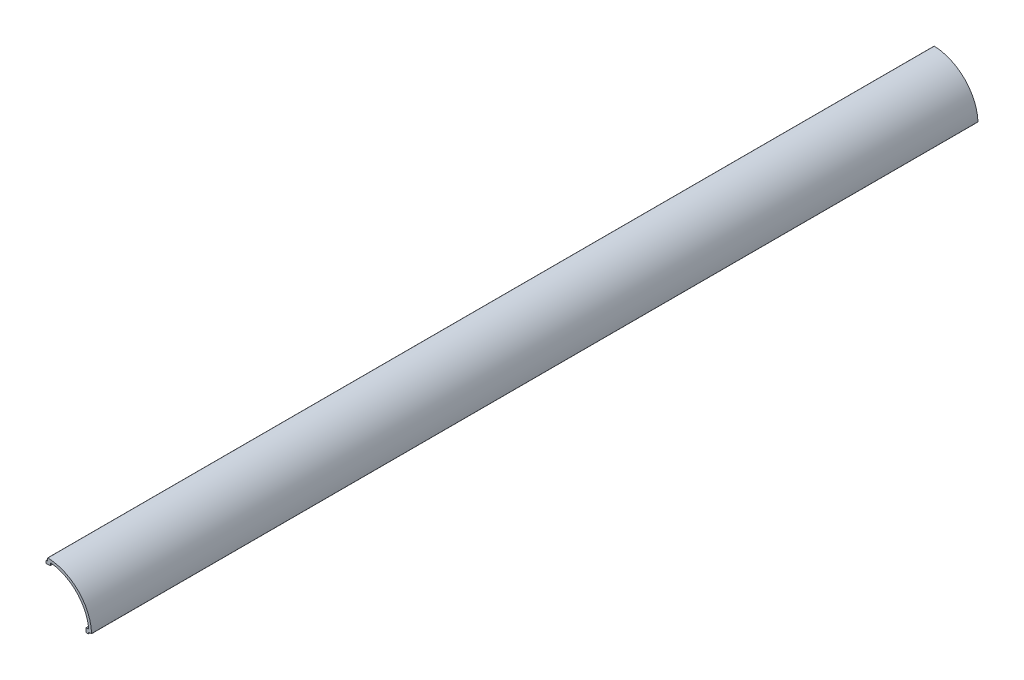
ISO-10303-21;
HEADER;
FILE_DESCRIPTION(('STEP AP214'),'2;1');
FILE_NAME('part.step','',(''),(''),'','','');
FILE_SCHEMA(('AUTOMOTIVE_DESIGN { 1 0 10303 214 1 1 1 1 }'));
ENDSEC;
DATA;
#1=APPLICATION_CONTEXT('core data for automotive mechanical design processes');
#2=APPLICATION_PROTOCOL_DEFINITION('international standard','automotive_design',2000,#1);
#3=PRODUCT_CONTEXT('',#1,'mechanical');
#4=PRODUCT('Part','Part','',(#3));
#5=PRODUCT_RELATED_PRODUCT_CATEGORY('part','',(#4));
#6=PRODUCT_DEFINITION_FORMATION('','',#4);
#7=PRODUCT_DEFINITION_CONTEXT('part definition',#1,'design');
#8=PRODUCT_DEFINITION('design','',#6,#7);
#9=PRODUCT_DEFINITION_SHAPE('','',#8);
#10=(LENGTH_UNIT() NAMED_UNIT(*) SI_UNIT(.MILLI.,.METRE.));
#11=(NAMED_UNIT(*) PLANE_ANGLE_UNIT() SI_UNIT($,.RADIAN.));
#12=(NAMED_UNIT(*) SI_UNIT($,.STERADIAN.) SOLID_ANGLE_UNIT());
#13=UNCERTAINTY_MEASURE_WITH_UNIT(LENGTH_MEASURE(1.E-05),#10,'distance_accuracy_value','');
#14=(GEOMETRIC_REPRESENTATION_CONTEXT(3) GLOBAL_UNCERTAINTY_ASSIGNED_CONTEXT((#13)) GLOBAL_UNIT_ASSIGNED_CONTEXT((#10,
#11,#12)) REPRESENTATION_CONTEXT('',''));
#15=CARTESIAN_POINT('',(0.,0.,0.));
#16=DIRECTION('',(0.,0.,1.));
#17=DIRECTION('',(1.,0.,0.));
#18=AXIS2_PLACEMENT_3D('',#15,#16,#17);
#19=CARTESIAN_POINT('',(13.5166295470958,0.,150.));
#20=DIRECTION('',(1.,0.,0.));
#21=DIRECTION('',(0.,1.,0.));
#22=AXIS2_PLACEMENT_3D('',#19,#20,#21);
#23=PLANE('',#22);
#24=DIRECTION('',(0.,-1.,0.));
#25=VECTOR('',#24,1.);
#26=CARTESIAN_POINT('',(13.5166295470958,0.,150.));
#27=LINE('',#26,#25);
#28=CARTESIAN_POINT('',(13.5166295470958,1.35000000000005,150.));
#29=VERTEX_POINT('',#28);
#30=CARTESIAN_POINT('',(13.5166295470958,0.100000000000053,150.));
#31=VERTEX_POINT('',#30);
#32=EDGE_CURVE('E233',#29,#31,#27,.T.);
#33=ORIENTED_EDGE('',*,*,#32,.F.);
#34=DIRECTION('',(0.,0.,-1.));
#35=VECTOR('',#34,1.);
#36=CARTESIAN_POINT('',(13.5166295470958,1.35000000000005,150.));
#37=LINE('',#36,#35);
#38=CARTESIAN_POINT('',(13.5166295470958,1.35000000000005,-150.));
#39=VERTEX_POINT('',#38);
#40=EDGE_CURVE('E278',#29,#39,#37,.T.);
#41=ORIENTED_EDGE('',*,*,#40,.T.);
#42=DIRECTION('',(0.,-1.,0.));
#43=VECTOR('',#42,1.);
#44=CARTESIAN_POINT('',(13.5166295470958,0.,-150.));
#45=LINE('',#44,#43);
#46=CARTESIAN_POINT('',(13.5166295470958,0.100000000000053,-150.));
#47=VERTEX_POINT('',#46);
#48=EDGE_CURVE('E366',#39,#47,#45,.T.);
#49=ORIENTED_EDGE('',*,*,#48,.T.);
#50=DIRECTION('',(0.,0.,-1.));
#51=VECTOR('',#50,1.);
#52=CARTESIAN_POINT('',(13.5166295470958,0.100000000000053,150.));
#53=LINE('',#52,#51);
#54=EDGE_CURVE('E276',#47,#31,#53,.F.);
#55=ORIENTED_EDGE('',*,*,#54,.T.);
#56=EDGE_LOOP('',(#33,#41,#49,#55));
#57=FACE_BOUND('',#56,.T.);
#58=ADVANCED_FACE('F33',(#57),#23,.F.);
#59=CARTESIAN_POINT('',(14.4166295470958,0.,150.));
#60=DIRECTION('',(0.,-1.,0.));
#61=DIRECTION('',(1.,0.,0.));
#62=AXIS2_PLACEMENT_3D('',#59,#60,#61);
#63=PLANE('',#62);
#64=DIRECTION('',(-1.,0.,0.));
#65=VECTOR('',#64,1.);
#66=CARTESIAN_POINT('',(14.4166295470958,0.,-150.));
#67=LINE('',#66,#65);
#68=CARTESIAN_POINT('',(14.3166295470958,0.,-150.));
#69=VERTEX_POINT('',#68);
#70=CARTESIAN_POINT('',(13.6166295470958,0.,-150.));
#71=VERTEX_POINT('',#70);
#72=EDGE_CURVE('E369',#69,#71,#67,.T.);
#73=ORIENTED_EDGE('',*,*,#72,.F.);
#74=DIRECTION('',(0.,0.,-1.));
#75=VECTOR('',#74,1.);
#76=CARTESIAN_POINT('',(14.3166295470958,0.,150.));
#77=LINE('',#76,#75);
#78=CARTESIAN_POINT('',(14.3166295470958,0.,150.));
#79=VERTEX_POINT('',#78);
#80=EDGE_CURVE('E299',#69,#79,#77,.F.);
#81=ORIENTED_EDGE('',*,*,#80,.T.);
#82=DIRECTION('',(-1.,0.,0.));
#83=VECTOR('',#82,1.);
#84=CARTESIAN_POINT('',(14.4166295470958,0.,150.));
#85=LINE('',#84,#83);
#86=CARTESIAN_POINT('',(13.6166295470958,0.,150.));
#87=VERTEX_POINT('',#86);
#88=EDGE_CURVE('E647',#79,#87,#85,.T.);
#89=ORIENTED_EDGE('',*,*,#88,.T.);
#90=DIRECTION('',(0.,0.,-1.));
#91=VECTOR('',#90,1.);
#92=CARTESIAN_POINT('',(13.6166295470958,0.,-150.));
#93=LINE('',#92,#91);
#94=EDGE_CURVE('E296',#87,#71,#93,.T.);
#95=ORIENTED_EDGE('',*,*,#94,.T.);
#96=EDGE_LOOP('',(#73,#81,#89,#95));
#97=FACE_BOUND('',#96,.T.);
#98=ADVANCED_FACE('F404',(#97),#63,.T.);
#99=CARTESIAN_POINT('',(14.4166295470958,0.,150.));
#100=DIRECTION('',(1.,0.,0.));
#101=DIRECTION('',(0.,1.,0.));
#102=AXIS2_PLACEMENT_3D('',#99,#100,#101);
#103=PLANE('',#102);
#104=DIRECTION('',(0.,-1.,0.));
#105=VECTOR('',#104,1.);
#106=CARTESIAN_POINT('',(14.4166295470958,0.,-150.));
#107=LINE('',#106,#105);
#108=CARTESIAN_POINT('',(14.4166295470958,0.450000000000057,-150.));
#109=VERTEX_POINT('',#108);
#110=CARTESIAN_POINT('',(14.4166295470958,0.100000000000058,-150.));
#111=VERTEX_POINT('',#110);
#112=EDGE_CURVE('E372',#109,#111,#107,.T.);
#113=ORIENTED_EDGE('',*,*,#112,.F.);
#114=DIRECTION('',(0.,0.,-1.));
#115=VECTOR('',#114,1.);
#116=CARTESIAN_POINT('',(14.4166295470958,0.450000000000057,150.));
#117=LINE('',#116,#115);
#118=CARTESIAN_POINT('',(14.4166295470958,0.450000000000057,150.));
#119=VERTEX_POINT('',#118);
#120=EDGE_CURVE('E294',#109,#119,#117,.F.);
#121=ORIENTED_EDGE('',*,*,#120,.T.);
#122=DIRECTION('',(0.,-1.,0.));
#123=VECTOR('',#122,1.);
#124=CARTESIAN_POINT('',(14.4166295470958,0.,150.));
#125=LINE('',#124,#123);
#126=CARTESIAN_POINT('',(14.4166295470958,0.100000000000058,150.));
#127=VERTEX_POINT('',#126);
#128=EDGE_CURVE('E642',#119,#127,#125,.T.);
#129=ORIENTED_EDGE('',*,*,#128,.T.);
#130=DIRECTION('',(0.,0.,-1.));
#131=VECTOR('',#130,1.);
#132=CARTESIAN_POINT('',(14.4166295470958,0.100000000000058,150.));
#133=LINE('',#132,#131);
#134=EDGE_CURVE('E291',#127,#111,#133,.T.);
#135=ORIENTED_EDGE('',*,*,#134,.T.);
#136=EDGE_LOOP('',(#113,#121,#129,#135));
#137=FACE_BOUND('',#136,.T.);
#138=ADVANCED_FACE('F410',(#137),#103,.T.);
#139=CARTESIAN_POINT('',(13.9666295470958,0.550000000000055,150.));
#140=DIRECTION('',(0.,-1.,0.));
#141=DIRECTION('',(1.,0.,0.));
#142=AXIS2_PLACEMENT_3D('',#139,#140,#141);
#143=PLANE('',#142);
#144=DIRECTION('',(-1.,0.,0.));
#145=VECTOR('',#144,1.);
#146=CARTESIAN_POINT('',(13.9666295470958,0.550000000000055,-150.));
#147=LINE('',#146,#145);
#148=CARTESIAN_POINT('',(15.3362316101446,0.550000000000062,-150.));
#149=VERTEX_POINT('',#148);
#150=CARTESIAN_POINT('',(14.5166295470958,0.550000000000057,-150.));
#151=VERTEX_POINT('',#150);
#152=EDGE_CURVE('E375',#149,#151,#147,.T.);
#153=ORIENTED_EDGE('',*,*,#152,.F.);
#154=DIRECTION('',(0.,0.,-1.));
#155=VECTOR('',#154,1.);
#156=CARTESIAN_POINT('',(15.3362316101446,0.550000000000062,150.));
#157=LINE('',#156,#155);
#158=CARTESIAN_POINT('',(15.3362316101446,0.550000000000062,150.));
#159=VERTEX_POINT('',#158);
#160=EDGE_CURVE('E289',#149,#159,#157,.F.);
#161=ORIENTED_EDGE('',*,*,#160,.T.);
#162=DIRECTION('',(-1.,0.,0.));
#163=VECTOR('',#162,1.);
#164=CARTESIAN_POINT('',(13.9666295470958,0.550000000000055,150.));
#165=LINE('',#164,#163);
#166=CARTESIAN_POINT('',(14.5166295470958,0.550000000000057,150.));
#167=VERTEX_POINT('',#166);
#168=EDGE_CURVE('E640',#159,#167,#165,.T.);
#169=ORIENTED_EDGE('',*,*,#168,.T.);
#170=DIRECTION('',(0.,0.,-1.));
#171=VECTOR('',#170,1.);
#172=CARTESIAN_POINT('',(14.5166295470958,0.550000000000057,-150.));
#173=LINE('',#172,#171);
#174=EDGE_CURVE('E286',#167,#151,#173,.T.);
#175=ORIENTED_EDGE('',*,*,#174,.T.);
#176=EDGE_LOOP('',(#153,#161,#169,#175));
#177=FACE_BOUND('',#176,.T.);
#178=ADVANCED_FACE('F599',(#177),#143,.T.);
#179=CARTESIAN_POINT('',(0.,0.,150.));
#180=DIRECTION('',(0.,0.,-1.));
#181=DIRECTION('',(-1.,0.,0.));
#182=AXIS2_PLACEMENT_3D('',#179,#180,#181);
#183=CYLINDRICAL_SURFACE('',#182,15.45);
#184=CARTESIAN_POINT('',(0.,0.,150.));
#185=DIRECTION('',(0.,0.,1.));
#186=DIRECTION('',(1.,0.,0.));
#187=AXIS2_PLACEMENT_3D('',#184,#185,#186);
#188=CIRCLE('',#187,15.45);
#189=CARTESIAN_POINT('',(0.654234527687296,15.4361419137938,150.));
#190=VERTEX_POINT('',#189);
#191=CARTESIAN_POINT('',(15.4361419137938,0.654234527687359,150.));
#192=VERTEX_POINT('',#191);
#193=EDGE_CURVE('E357',#190,#192,#188,.F.);
#194=ORIENTED_EDGE('',*,*,#193,.T.);
#195=DIRECTION('',(0.,0.,-1.));
#196=VECTOR('',#195,1.);
#197=CARTESIAN_POINT('',(15.4361419137938,0.654234527687359,150.));
#198=LINE('',#197,#196);
#199=CARTESIAN_POINT('',(15.4361419137938,0.654234527687359,-150.));
#200=VERTEX_POINT('',#199);
#201=EDGE_CURVE('E283',#192,#200,#198,.T.);
#202=ORIENTED_EDGE('',*,*,#201,.T.);
#203=CARTESIAN_POINT('',(0.,0.,-150.));
#204=DIRECTION('',(0.,0.,1.));
#205=DIRECTION('',(1.,0.,0.));
#206=AXIS2_PLACEMENT_3D('',#203,#204,#205);
#207=CIRCLE('',#206,15.45);
#208=CARTESIAN_POINT('',(0.654234527687296,15.4361419137938,-150.));
#209=VERTEX_POINT('',#208);
#210=EDGE_CURVE('E339',#209,#200,#207,.F.);
#211=ORIENTED_EDGE('',*,*,#210,.F.);
#212=DIRECTION('',(0.,0.,-1.));
#213=VECTOR('',#212,1.);
#214=CARTESIAN_POINT('',(0.654234527687296,15.4361419137938,150.));
#215=LINE('',#214,#213);
#216=EDGE_CURVE('E281',#209,#190,#215,.F.);
#217=ORIENTED_EDGE('',*,*,#216,.T.);
#218=EDGE_LOOP('',(#194,#202,#211,#217));
#219=FACE_BOUND('',#218,.T.);
#220=ADVANCED_FACE('F590',(#219),#183,.T.);
#221=CARTESIAN_POINT('',(0.55,13.9666295470958,150.));
#222=DIRECTION('',(-1.,0.,0.));
#223=DIRECTION('',(0.,0.,1.));
#224=AXIS2_PLACEMENT_3D('',#221,#222,#223);
#225=PLANE('',#224);
#226=DIRECTION('',(0.,1.,0.));
#227=VECTOR('',#226,1.);
#228=CARTESIAN_POINT('',(0.55,13.9666295470958,150.));
#229=LINE('',#228,#227);
#230=CARTESIAN_POINT('',(0.55,14.5166295470958,150.));
#231=VERTEX_POINT('',#230);
#232=CARTESIAN_POINT('',(0.55,15.3362316101447,150.));
#233=VERTEX_POINT('',#232);
#234=EDGE_CURVE('E348',#231,#233,#229,.T.);
#235=ORIENTED_EDGE('',*,*,#234,.T.);
#236=DIRECTION('',(0.,0.,-1.));
#237=VECTOR('',#236,1.);
#238=CARTESIAN_POINT('',(0.55,15.3362316101447,150.));
#239=LINE('',#238,#237);
#240=CARTESIAN_POINT('',(0.55,15.3362316101447,-150.));
#241=VERTEX_POINT('',#240);
#242=EDGE_CURVE('E303',#233,#241,#239,.T.);
#243=ORIENTED_EDGE('',*,*,#242,.T.);
#244=DIRECTION('',(0.,1.,0.));
#245=VECTOR('',#244,1.);
#246=CARTESIAN_POINT('',(0.55,13.9666295470958,-150.));
#247=LINE('',#246,#245);
#248=CARTESIAN_POINT('',(0.55,14.5166295470958,-150.));
#249=VERTEX_POINT('',#248);
#250=EDGE_CURVE('E328',#249,#241,#247,.T.);
#251=ORIENTED_EDGE('',*,*,#250,.F.);
#252=DIRECTION('',(0.,0.,-1.));
#253=VECTOR('',#252,1.);
#254=CARTESIAN_POINT('',(0.55,14.5166295470958,150.));
#255=LINE('',#254,#253);
#256=EDGE_CURVE('E301',#249,#231,#255,.F.);
#257=ORIENTED_EDGE('',*,*,#256,.T.);
#258=EDGE_LOOP('',(#235,#243,#251,#257));
#259=FACE_BOUND('',#258,.T.);
#260=ADVANCED_FACE('F336',(#259),#225,.T.);
#261=CARTESIAN_POINT('',(0.,14.4166295470958,150.));
#262=DIRECTION('',(0.,1.,0.));
#263=DIRECTION('',(0.,0.,1.));
#264=AXIS2_PLACEMENT_3D('',#261,#262,#263);
#265=PLANE('',#264);
#266=DIRECTION('',(1.,0.,0.));
#267=VECTOR('',#266,1.);
#268=CARTESIAN_POINT('',(0.,14.4166295470958,-150.));
#269=LINE('',#268,#267);
#270=CARTESIAN_POINT('',(0.1,14.4166295470958,-150.));
#271=VERTEX_POINT('',#270);
#272=CARTESIAN_POINT('',(0.45,14.4166295470958,-150.));
#273=VERTEX_POINT('',#272);
#274=EDGE_CURVE('E330',#271,#273,#269,.T.);
#275=ORIENTED_EDGE('',*,*,#274,.F.);
#276=DIRECTION('',(0.,0.,-1.));
#277=VECTOR('',#276,1.);
#278=CARTESIAN_POINT('',(0.1,14.4166295470958,150.));
#279=LINE('',#278,#277);
#280=CARTESIAN_POINT('',(0.1,14.4166295470958,150.));
#281=VERTEX_POINT('',#280);
#282=EDGE_CURVE('E314',#271,#281,#279,.F.);
#283=ORIENTED_EDGE('',*,*,#282,.T.);
#284=DIRECTION('',(1.,0.,0.));
#285=VECTOR('',#284,1.);
#286=CARTESIAN_POINT('',(0.,14.4166295470958,150.));
#287=LINE('',#286,#285);
#288=CARTESIAN_POINT('',(0.45,14.4166295470958,150.));
#289=VERTEX_POINT('',#288);
#290=EDGE_CURVE('E346',#281,#289,#287,.T.);
#291=ORIENTED_EDGE('',*,*,#290,.T.);
#292=DIRECTION('',(0.,0.,-1.));
#293=VECTOR('',#292,1.);
#294=CARTESIAN_POINT('',(0.45,14.4166295470958,-150.));
#295=LINE('',#294,#293);
#296=EDGE_CURVE('E311',#289,#273,#295,.T.);
#297=ORIENTED_EDGE('',*,*,#296,.T.);
#298=EDGE_LOOP('',(#275,#283,#291,#297));
#299=FACE_BOUND('',#298,.T.);
#300=ADVANCED_FACE('F350',(#299),#265,.T.);
#301=CARTESIAN_POINT('',(0.,13.5166295470958,150.));
#302=DIRECTION('',(-1.,0.,0.));
#303=DIRECTION('',(0.,0.,1.));
#304=AXIS2_PLACEMENT_3D('',#301,#302,#303);
#305=PLANE('',#304);
#306=DIRECTION('',(0.,1.,0.));
#307=VECTOR('',#306,1.);
#308=CARTESIAN_POINT('',(0.,13.5166295470958,-150.));
#309=LINE('',#308,#307);
#310=CARTESIAN_POINT('',(0.,13.6166295470958,-150.));
#311=VERTEX_POINT('',#310);
#312=CARTESIAN_POINT('',(0.,14.3166295470958,-150.));
#313=VERTEX_POINT('',#312);
#314=EDGE_CURVE('E228',#311,#313,#309,.T.);
#315=ORIENTED_EDGE('',*,*,#314,.F.);
#316=DIRECTION('',(0.,0.,-1.));
#317=VECTOR('',#316,1.);
#318=CARTESIAN_POINT('',(0.,13.6166295470958,150.));
#319=LINE('',#318,#317);
#320=CARTESIAN_POINT('',(0.,13.6166295470958,150.));
#321=VERTEX_POINT('',#320);
#322=EDGE_CURVE('E309',#311,#321,#319,.F.);
#323=ORIENTED_EDGE('',*,*,#322,.T.);
#324=DIRECTION('',(0.,1.,0.));
#325=VECTOR('',#324,1.);
#326=CARTESIAN_POINT('',(0.,13.5166295470958,150.));
#327=LINE('',#326,#325);
#328=CARTESIAN_POINT('',(0.,14.3166295470958,150.));
#329=VERTEX_POINT('',#328);
#330=EDGE_CURVE('E352',#321,#329,#327,.T.);
#331=ORIENTED_EDGE('',*,*,#330,.T.);
#332=DIRECTION('',(0.,0.,-1.));
#333=VECTOR('',#332,1.);
#334=CARTESIAN_POINT('',(0.,14.3166295470958,150.));
#335=LINE('',#334,#333);
#336=EDGE_CURVE('E306',#329,#313,#335,.T.);
#337=ORIENTED_EDGE('',*,*,#336,.T.);
#338=EDGE_LOOP('',(#315,#323,#331,#337));
#339=FACE_BOUND('',#338,.T.);
#340=ADVANCED_FACE('F384',(#339),#305,.T.);
#341=CARTESIAN_POINT('',(0.,13.5166295470958,150.));
#342=DIRECTION('',(0.,1.,0.));
#343=DIRECTION('',(0.,0.,1.));
#344=AXIS2_PLACEMENT_3D('',#341,#342,#343);
#345=PLANE('',#344);
#346=DIRECTION('',(1.,0.,0.));
#347=VECTOR('',#346,1.);
#348=CARTESIAN_POINT('',(0.,13.5166295470958,-150.));
#349=LINE('',#348,#347);
#350=CARTESIAN_POINT('',(0.1,13.5166295470958,-150.));
#351=VERTEX_POINT('',#350);
#352=CARTESIAN_POINT('',(1.35,13.5166295470958,-150.));
#353=VERTEX_POINT('',#352);
#354=EDGE_CURVE('E223',#351,#353,#349,.T.);
#355=ORIENTED_EDGE('',*,*,#354,.T.);
#356=DIRECTION('',(0.,0.,-1.));
#357=VECTOR('',#356,1.);
#358=CARTESIAN_POINT('',(1.35,13.5166295470958,150.));
#359=LINE('',#358,#357);
#360=CARTESIAN_POINT('',(1.35,13.5166295470958,150.));
#361=VERTEX_POINT('',#360);
#362=EDGE_CURVE('E200',#353,#361,#359,.F.);
#363=ORIENTED_EDGE('',*,*,#362,.T.);
#364=DIRECTION('',(1.,0.,0.));
#365=VECTOR('',#364,1.);
#366=CARTESIAN_POINT('',(0.,13.5166295470958,150.));
#367=LINE('',#366,#365);
#368=CARTESIAN_POINT('',(0.1,13.5166295470958,150.));
#369=VERTEX_POINT('',#368);
#370=EDGE_CURVE('E355',#369,#361,#367,.T.);
#371=ORIENTED_EDGE('',*,*,#370,.F.);
#372=DIRECTION('',(0.,0.,-1.));
#373=VECTOR('',#372,1.);
#374=CARTESIAN_POINT('',(0.1,13.5166295470958,-150.));
#375=LINE('',#374,#373);
#376=EDGE_CURVE('E205',#369,#351,#375,.T.);
#377=ORIENTED_EDGE('',*,*,#376,.T.);
#378=EDGE_LOOP('',(#355,#363,#371,#377));
#379=FACE_BOUND('',#378,.T.);
#380=ADVANCED_FACE('F393',(#379),#345,.F.);
#381=CARTESIAN_POINT('',(1.45,13.9666295470958,150.));
#382=DIRECTION('',(-1.,0.,0.));
#383=DIRECTION('',(0.,0.,1.));
#384=AXIS2_PLACEMENT_3D('',#381,#382,#383);
#385=PLANE('',#384);
#386=DIRECTION('',(0.,1.,0.));
#387=VECTOR('',#386,1.);
#388=CARTESIAN_POINT('',(1.45,13.9666295470958,150.));
#389=LINE('',#388,#387);
#390=CARTESIAN_POINT('',(1.45,13.6166295470958,150.));
#391=VERTEX_POINT('',#390);
#392=CARTESIAN_POINT('',(1.45,14.3666279968544,150.));
#393=VERTEX_POINT('',#392);
#394=EDGE_CURVE('E215',#391,#393,#389,.T.);
#395=ORIENTED_EDGE('',*,*,#394,.F.);
#396=DIRECTION('',(0.,0.,-1.));
#397=VECTOR('',#396,1.);
#398=CARTESIAN_POINT('',(1.45,13.6166295470958,150.));
#399=LINE('',#398,#397);
#400=CARTESIAN_POINT('',(1.45,13.6166295470958,-150.));
#401=VERTEX_POINT('',#400);
#402=EDGE_CURVE('E199',#391,#401,#399,.T.);
#403=ORIENTED_EDGE('',*,*,#402,.T.);
#404=DIRECTION('',(0.,1.,0.));
#405=VECTOR('',#404,1.);
#406=CARTESIAN_POINT('',(1.45,13.9666295470958,-150.));
#407=LINE('',#406,#405);
#408=CARTESIAN_POINT('',(1.45,14.3666279968544,-150.));
#409=VERTEX_POINT('',#408);
#410=EDGE_CURVE('E212',#401,#409,#407,.T.);
#411=ORIENTED_EDGE('',*,*,#410,.T.);
#412=DIRECTION('',(0.,0.,1.));
#413=VECTOR('',#412,1.);
#414=CARTESIAN_POINT('',(1.45,14.3666279968544,150.));
#415=LINE('',#414,#413);
#416=EDGE_CURVE('E217',#409,#393,#415,.T.);
#417=ORIENTED_EDGE('',*,*,#416,.T.);
#418=EDGE_LOOP('',(#395,#403,#411,#417));
#419=FACE_BOUND('',#418,.T.);
#420=ADVANCED_FACE('F211',(#419),#385,.F.);
#421=CARTESIAN_POINT('',(0.,0.,150.));
#422=DIRECTION('',(0.,0.,-1.));
#423=DIRECTION('',(-1.,0.,0.));
#424=AXIS2_PLACEMENT_3D('',#421,#422,#423);
#425=CYLINDRICAL_SURFACE('',#424,14.55);
#426=CARTESIAN_POINT('',(0.,0.,150.));
#427=DIRECTION('',(0.,0.,1.));
#428=DIRECTION('',(1.,0.,0.));
#429=AXIS2_PLACEMENT_3D('',#426,#427,#428);
#430=CIRCLE('',#429,14.55);
#431=CARTESIAN_POINT('',(1.56072664359862,14.4660510279745,150.));
#432=VERTEX_POINT('',#431);
#433=CARTESIAN_POINT('',(14.4660510279745,1.56072664359867,150.));
#434=VERTEX_POINT('',#433);
#435=EDGE_CURVE('E363',#432,#434,#430,.F.);
#436=ORIENTED_EDGE('',*,*,#435,.F.);
#437=DIRECTION('',(0.,0.,-1.));
#438=VECTOR('',#437,1.);
#439=CARTESIAN_POINT('',(1.56072664359862,14.4660510279745,150.));
#440=LINE('',#439,#438);
#441=CARTESIAN_POINT('',(1.56072664359862,14.4660510279745,-150.));
#442=VERTEX_POINT('',#441);
#443=EDGE_CURVE('E269',#432,#442,#440,.T.);
#444=ORIENTED_EDGE('',*,*,#443,.T.);
#445=CARTESIAN_POINT('',(0.,0.,-150.));
#446=DIRECTION('',(0.,0.,1.));
#447=DIRECTION('',(1.,0.,0.));
#448=AXIS2_PLACEMENT_3D('',#445,#446,#447);
#449=CIRCLE('',#448,14.55);
#450=CARTESIAN_POINT('',(14.4660510279745,1.56072664359867,-150.));
#451=VERTEX_POINT('',#450);
#452=EDGE_CURVE('E222',#442,#451,#449,.F.);
#453=ORIENTED_EDGE('',*,*,#452,.T.);
#454=DIRECTION('',(0.,0.,-1.));
#455=VECTOR('',#454,1.);
#456=CARTESIAN_POINT('',(14.4660510279745,1.56072664359867,150.));
#457=LINE('',#456,#455);
#458=EDGE_CURVE('E267',#451,#434,#457,.F.);
#459=ORIENTED_EDGE('',*,*,#458,.T.);
#460=EDGE_LOOP('',(#436,#444,#453,#459));
#461=FACE_BOUND('',#460,.T.);
#462=ADVANCED_FACE('F400',(#461),#425,.F.);
#463=CARTESIAN_POINT('',(13.9666295470958,1.45000000000005,150.));
#464=DIRECTION('',(0.,-1.,0.));
#465=DIRECTION('',(1.,0.,0.));
#466=AXIS2_PLACEMENT_3D('',#463,#464,#465);
#467=PLANE('',#466);
#468=DIRECTION('',(-1.,0.,0.));
#469=VECTOR('',#468,1.);
#470=CARTESIAN_POINT('',(13.9666295470958,1.45000000000005,150.));
#471=LINE('',#470,#469);
#472=CARTESIAN_POINT('',(14.3666279968544,1.45000000000006,150.));
#473=VERTEX_POINT('',#472);
#474=CARTESIAN_POINT('',(13.6166295470958,1.45000000000005,150.));
#475=VERTEX_POINT('',#474);
#476=EDGE_CURVE('E234',#473,#475,#471,.T.);
#477=ORIENTED_EDGE('',*,*,#476,.F.);
#478=DIRECTION('',(0.,0.,1.));
#479=VECTOR('',#478,1.);
#480=CARTESIAN_POINT('',(14.3666279968544,1.45000000000006,-150.));
#481=LINE('',#480,#479);
#482=CARTESIAN_POINT('',(14.3666279968544,1.45000000000006,-150.));
#483=VERTEX_POINT('',#482);
#484=EDGE_CURVE('E273',#473,#483,#481,.F.);
#485=ORIENTED_EDGE('',*,*,#484,.T.);
#486=DIRECTION('',(-1.,0.,0.));
#487=VECTOR('',#486,1.);
#488=CARTESIAN_POINT('',(13.9666295470958,1.45000000000005,-150.));
#489=LINE('',#488,#487);
#490=CARTESIAN_POINT('',(13.6166295470958,1.45000000000005,-150.));
#491=VERTEX_POINT('',#490);
#492=EDGE_CURVE('E226',#483,#491,#489,.T.);
#493=ORIENTED_EDGE('',*,*,#492,.T.);
#494=DIRECTION('',(0.,0.,-1.));
#495=VECTOR('',#494,1.);
#496=CARTESIAN_POINT('',(13.6166295470958,1.45000000000005,150.));
#497=LINE('',#496,#495);
#498=EDGE_CURVE('E48',#491,#475,#497,.F.);
#499=ORIENTED_EDGE('',*,*,#498,.T.);
#500=EDGE_LOOP('',(#477,#485,#493,#499));
#501=FACE_BOUND('',#500,.T.);
#502=ADVANCED_FACE('F540',(#501),#467,.F.);
#503=CARTESIAN_POINT('',(0.,0.,150.));
#504=DIRECTION('',(0.,0.,1.));
#505=DIRECTION('',(1.,0.,0.));
#506=AXIS2_PLACEMENT_3D('',#503,#504,#505);
#507=PLANE('',#506);
#508=ORIENTED_EDGE('',*,*,#370,.T.);
#509=CARTESIAN_POINT('',(1.35,13.6166295470958,150.));
#510=DIRECTION('',(0.,0.,1.));
#511=DIRECTION('',(1.,0.,0.));
#512=AXIS2_PLACEMENT_3D('',#509,#510,#511);
#513=CIRCLE('',#512,0.1);
#514=EDGE_CURVE('E265',#361,#391,#513,.T.);
#515=ORIENTED_EDGE('',*,*,#514,.T.);
#516=ORIENTED_EDGE('',*,*,#394,.T.);
#517=CARTESIAN_POINT('',(1.55,14.3666279968544,150.));
#518=DIRECTION('',(0.,0.,1.));
#519=DIRECTION('',(1.,0.,0.));
#520=AXIS2_PLACEMENT_3D('',#517,#518,#519);
#521=CIRCLE('',#520,0.1);
#522=EDGE_CURVE('E317',#393,#432,#521,.F.);
#523=ORIENTED_EDGE('',*,*,#522,.T.);
#524=ORIENTED_EDGE('',*,*,#435,.T.);
#525=CARTESIAN_POINT('',(14.3666279968544,1.55000000000006,150.));
#526=DIRECTION('',(0.,0.,1.));
#527=DIRECTION('',(1.,0.,0.));
#528=AXIS2_PLACEMENT_3D('',#525,#526,#527);
#529=CIRCLE('',#528,0.1);
#530=EDGE_CURVE('E55',#434,#473,#529,.F.);
#531=ORIENTED_EDGE('',*,*,#530,.T.);
#532=ORIENTED_EDGE('',*,*,#476,.T.);
#533=CARTESIAN_POINT('',(13.6166295470958,1.35000000000005,150.));
#534=DIRECTION('',(0.,0.,1.));
#535=DIRECTION('',(1.,0.,0.));
#536=AXIS2_PLACEMENT_3D('',#533,#534,#535);
#537=CIRCLE('',#536,0.1);
#538=EDGE_CURVE('E263',#475,#29,#537,.T.);
#539=ORIENTED_EDGE('',*,*,#538,.T.);
#540=ORIENTED_EDGE('',*,*,#32,.T.);
#541=CARTESIAN_POINT('',(13.6166295470958,0.100000000000054,150.));
#542=DIRECTION('',(0.,0.,1.));
#543=DIRECTION('',(1.,0.,0.));
#544=AXIS2_PLACEMENT_3D('',#541,#542,#543);
#545=CIRCLE('',#544,0.1);
#546=EDGE_CURVE('E257',#31,#87,#545,.T.);
#547=ORIENTED_EDGE('',*,*,#546,.T.);
#548=ORIENTED_EDGE('',*,*,#88,.F.);
#549=CARTESIAN_POINT('',(14.3166295470958,0.100000000000057,150.));
#550=DIRECTION('',(0.,0.,1.));
#551=DIRECTION('',(1.,0.,0.));
#552=AXIS2_PLACEMENT_3D('',#549,#550,#551);
#553=CIRCLE('',#552,0.1);
#554=EDGE_CURVE('E259',#79,#127,#553,.T.);
#555=ORIENTED_EDGE('',*,*,#554,.T.);
#556=ORIENTED_EDGE('',*,*,#128,.F.);
#557=CARTESIAN_POINT('',(14.5166295470958,0.450000000000058,150.));
#558=DIRECTION('',(0.,0.,1.));
#559=DIRECTION('',(1.,0.,0.));
#560=AXIS2_PLACEMENT_3D('',#557,#558,#559);
#561=CIRCLE('',#560,0.1);
#562=EDGE_CURVE('E324',#119,#167,#561,.F.);
#563=ORIENTED_EDGE('',*,*,#562,.T.);
#564=ORIENTED_EDGE('',*,*,#168,.F.);
#565=CARTESIAN_POINT('',(15.3362316101446,0.650000000000062,150.));
#566=DIRECTION('',(0.,0.,1.));
#567=DIRECTION('',(1.,0.,0.));
#568=AXIS2_PLACEMENT_3D('',#565,#566,#567);
#569=CIRCLE('',#568,0.1);
#570=EDGE_CURVE('E261',#159,#192,#569,.T.);
#571=ORIENTED_EDGE('',*,*,#570,.T.);
#572=ORIENTED_EDGE('',*,*,#193,.F.);
#573=CARTESIAN_POINT('',(0.65,15.3362316101447,150.));
#574=DIRECTION('',(0.,0.,1.));
#575=DIRECTION('',(1.,0.,0.));
#576=AXIS2_PLACEMENT_3D('',#573,#574,#575);
#577=CIRCLE('',#576,0.1);
#578=EDGE_CURVE('E255',#190,#233,#577,.T.);
#579=ORIENTED_EDGE('',*,*,#578,.T.);
#580=ORIENTED_EDGE('',*,*,#234,.F.);
#581=CARTESIAN_POINT('',(0.45,14.5166295470958,150.));
#582=DIRECTION('',(0.,0.,1.));
#583=DIRECTION('',(1.,0.,0.));
#584=AXIS2_PLACEMENT_3D('',#581,#582,#583);
#585=CIRCLE('',#584,0.1);
#586=EDGE_CURVE('E11',#231,#289,#585,.F.);
#587=ORIENTED_EDGE('',*,*,#586,.T.);
#588=ORIENTED_EDGE('',*,*,#290,.F.);
#589=CARTESIAN_POINT('',(0.1,14.3166295470958,150.));
#590=DIRECTION('',(0.,0.,1.));
#591=DIRECTION('',(1.,0.,0.));
#592=AXIS2_PLACEMENT_3D('',#589,#590,#591);
#593=CIRCLE('',#592,0.1);
#594=EDGE_CURVE('E251',#281,#329,#593,.T.);
#595=ORIENTED_EDGE('',*,*,#594,.T.);
#596=ORIENTED_EDGE('',*,*,#330,.F.);
#597=CARTESIAN_POINT('',(0.1,13.6166295470958,150.));
#598=DIRECTION('',(0.,0.,1.));
#599=DIRECTION('',(1.,0.,0.));
#600=AXIS2_PLACEMENT_3D('',#597,#598,#599);
#601=CIRCLE('',#600,0.1);
#602=EDGE_CURVE('E253',#321,#369,#601,.T.);
#603=ORIENTED_EDGE('',*,*,#602,.T.);
#604=EDGE_LOOP('',(#508,#515,#516,#523,#524,#531,#532,#539,#540,#547,#548,#555,#556,#563,#564,
#571,#572,#579,#580,#587,#588,#595,#596,#603));
#605=FACE_BOUND('',#604,.T.);
#606=ADVANCED_FACE('F345',(#605),#507,.T.);
#607=CARTESIAN_POINT('',(0.,0.,-150.));
#608=DIRECTION('',(0.,0.,1.));
#609=DIRECTION('',(1.,0.,0.));
#610=AXIS2_PLACEMENT_3D('',#607,#608,#609);
#611=PLANE('',#610);
#612=ORIENTED_EDGE('',*,*,#410,.F.);
#613=CARTESIAN_POINT('',(1.35,13.6166295470958,-150.));
#614=DIRECTION('',(0.,0.,1.));
#615=DIRECTION('',(1.,0.,0.));
#616=AXIS2_PLACEMENT_3D('',#613,#614,#615);
#617=CIRCLE('',#616,0.1);
#618=EDGE_CURVE('E195',#401,#353,#617,.F.);
#619=ORIENTED_EDGE('',*,*,#618,.T.);
#620=ORIENTED_EDGE('',*,*,#354,.F.);
#621=CARTESIAN_POINT('',(0.1,13.6166295470958,-150.));
#622=DIRECTION('',(0.,0.,1.));
#623=DIRECTION('',(1.,0.,0.));
#624=AXIS2_PLACEMENT_3D('',#621,#622,#623);
#625=CIRCLE('',#624,0.1);
#626=EDGE_CURVE('E237',#351,#311,#625,.F.);
#627=ORIENTED_EDGE('',*,*,#626,.T.);
#628=ORIENTED_EDGE('',*,*,#314,.T.);
#629=CARTESIAN_POINT('',(0.1,14.3166295470958,-150.));
#630=DIRECTION('',(0.,0.,1.));
#631=DIRECTION('',(1.,0.,0.));
#632=AXIS2_PLACEMENT_3D('',#629,#630,#631);
#633=CIRCLE('',#632,0.1);
#634=EDGE_CURVE('E216',#313,#271,#633,.F.);
#635=ORIENTED_EDGE('',*,*,#634,.T.);
#636=ORIENTED_EDGE('',*,*,#274,.T.);
#637=CARTESIAN_POINT('',(0.45,14.5166295470958,-150.));
#638=DIRECTION('',(0.,0.,1.));
#639=DIRECTION('',(1.,0.,0.));
#640=AXIS2_PLACEMENT_3D('',#637,#638,#639);
#641=CIRCLE('',#640,0.1);
#642=EDGE_CURVE('E41',#273,#249,#641,.T.);
#643=ORIENTED_EDGE('',*,*,#642,.T.);
#644=ORIENTED_EDGE('',*,*,#250,.T.);
#645=CARTESIAN_POINT('',(0.65,15.3362316101447,-150.));
#646=DIRECTION('',(0.,0.,1.));
#647=DIRECTION('',(1.,0.,0.));
#648=AXIS2_PLACEMENT_3D('',#645,#646,#647);
#649=CIRCLE('',#648,0.1);
#650=EDGE_CURVE('E239',#241,#209,#649,.F.);
#651=ORIENTED_EDGE('',*,*,#650,.T.);
#652=ORIENTED_EDGE('',*,*,#210,.T.);
#653=CARTESIAN_POINT('',(15.3362316101446,0.650000000000062,-150.));
#654=DIRECTION('',(0.,0.,1.));
#655=DIRECTION('',(1.,0.,0.));
#656=AXIS2_PLACEMENT_3D('',#653,#654,#655);
#657=CIRCLE('',#656,0.1);
#658=EDGE_CURVE('E245',#200,#149,#657,.F.);
#659=ORIENTED_EDGE('',*,*,#658,.T.);
#660=ORIENTED_EDGE('',*,*,#152,.T.);
#661=CARTESIAN_POINT('',(14.5166295470958,0.450000000000058,-150.));
#662=DIRECTION('',(0.,0.,1.));
#663=DIRECTION('',(1.,0.,0.));
#664=AXIS2_PLACEMENT_3D('',#661,#662,#663);
#665=CIRCLE('',#664,0.1);
#666=EDGE_CURVE('E322',#151,#109,#665,.T.);
#667=ORIENTED_EDGE('',*,*,#666,.T.);
#668=ORIENTED_EDGE('',*,*,#112,.T.);
#669=CARTESIAN_POINT('',(14.3166295470958,0.100000000000057,-150.));
#670=DIRECTION('',(0.,0.,1.));
#671=DIRECTION('',(1.,0.,0.));
#672=AXIS2_PLACEMENT_3D('',#669,#670,#671);
#673=CIRCLE('',#672,0.1);
#674=EDGE_CURVE('E243',#111,#69,#673,.F.);
#675=ORIENTED_EDGE('',*,*,#674,.T.);
#676=ORIENTED_EDGE('',*,*,#72,.T.);
#677=CARTESIAN_POINT('',(13.6166295470958,0.100000000000054,-150.));
#678=DIRECTION('',(0.,0.,1.));
#679=DIRECTION('',(1.,0.,0.));
#680=AXIS2_PLACEMENT_3D('',#677,#678,#679);
#681=CIRCLE('',#680,0.1);
#682=EDGE_CURVE('E241',#71,#47,#681,.F.);
#683=ORIENTED_EDGE('',*,*,#682,.T.);
#684=ORIENTED_EDGE('',*,*,#48,.F.);
#685=CARTESIAN_POINT('',(13.6166295470958,1.35000000000005,-150.));
#686=DIRECTION('',(0.,0.,1.));
#687=DIRECTION('',(1.,0.,0.));
#688=AXIS2_PLACEMENT_3D('',#685,#686,#687);
#689=CIRCLE('',#688,0.1);
#690=EDGE_CURVE('E206',#39,#491,#689,.F.);
#691=ORIENTED_EDGE('',*,*,#690,.T.);
#692=ORIENTED_EDGE('',*,*,#492,.F.);
#693=CARTESIAN_POINT('',(14.3666279968544,1.55000000000006,-150.));
#694=DIRECTION('',(0.,0.,1.));
#695=DIRECTION('',(1.,0.,0.));
#696=AXIS2_PLACEMENT_3D('',#693,#694,#695);
#697=CIRCLE('',#696,0.1);
#698=EDGE_CURVE('E319',#483,#451,#697,.T.);
#699=ORIENTED_EDGE('',*,*,#698,.T.);
#700=ORIENTED_EDGE('',*,*,#452,.F.);
#701=CARTESIAN_POINT('',(1.55,14.3666279968544,-150.));
#702=DIRECTION('',(0.,0.,1.));
#703=DIRECTION('',(1.,0.,0.));
#704=AXIS2_PLACEMENT_3D('',#701,#702,#703);
#705=CIRCLE('',#704,0.1);
#706=EDGE_CURVE('E221',#442,#409,#705,.T.);
#707=ORIENTED_EDGE('',*,*,#706,.T.);
#708=EDGE_LOOP('',(#612,#619,#620,#627,#628,#635,#636,#643,#644,#651,#652,#659,#660,#667,#668,
#675,#676,#683,#684,#691,#692,#699,#700,#707));
#709=FACE_BOUND('',#708,.T.);
#710=ADVANCED_FACE('F219',(#709),#611,.F.);
#711=CARTESIAN_POINT('',(1.35,13.6166295470958,150.));
#712=DIRECTION('',(0.,0.,-1.));
#713=DIRECTION('',(-1.,0.,0.));
#714=AXIS2_PLACEMENT_3D('',#711,#712,#713);
#715=CYLINDRICAL_SURFACE('',#714,0.1);
#716=ORIENTED_EDGE('',*,*,#514,.F.);
#717=ORIENTED_EDGE('',*,*,#362,.F.);
#718=ORIENTED_EDGE('',*,*,#618,.F.);
#719=ORIENTED_EDGE('',*,*,#402,.F.);
#720=EDGE_LOOP('',(#716,#717,#718,#719));
#721=FACE_BOUND('',#720,.T.);
#722=ADVANCED_FACE('F198',(#721),#715,.T.);
#723=CARTESIAN_POINT('',(1.55,14.3666279968544,150.));
#724=DIRECTION('',(0.,0.,-1.));
#725=DIRECTION('',(-1.,0.,0.));
#726=AXIS2_PLACEMENT_3D('',#723,#724,#725);
#727=CYLINDRICAL_SURFACE('',#726,0.1);
#728=ORIENTED_EDGE('',*,*,#522,.F.);
#729=ORIENTED_EDGE('',*,*,#416,.F.);
#730=ORIENTED_EDGE('',*,*,#706,.F.);
#731=ORIENTED_EDGE('',*,*,#443,.F.);
#732=EDGE_LOOP('',(#728,#729,#730,#731));
#733=FACE_BOUND('',#732,.T.);
#734=ADVANCED_FACE('F418',(#733),#727,.F.);
#735=CARTESIAN_POINT('',(14.3666279968544,1.55000000000006,150.));
#736=DIRECTION('',(0.,0.,-1.));
#737=DIRECTION('',(-1.,0.,0.));
#738=AXIS2_PLACEMENT_3D('',#735,#736,#737);
#739=CYLINDRICAL_SURFACE('',#738,0.1);
#740=ORIENTED_EDGE('',*,*,#530,.F.);
#741=ORIENTED_EDGE('',*,*,#458,.F.);
#742=ORIENTED_EDGE('',*,*,#698,.F.);
#743=ORIENTED_EDGE('',*,*,#484,.F.);
#744=EDGE_LOOP('',(#740,#741,#742,#743));
#745=FACE_BOUND('',#744,.T.);
#746=ADVANCED_FACE('F421',(#745),#739,.F.);
#747=CARTESIAN_POINT('',(13.6166295470958,1.35000000000005,150.));
#748=DIRECTION('',(0.,0.,-1.));
#749=DIRECTION('',(-1.,0.,0.));
#750=AXIS2_PLACEMENT_3D('',#747,#748,#749);
#751=CYLINDRICAL_SURFACE('',#750,0.1);
#752=ORIENTED_EDGE('',*,*,#538,.F.);
#753=ORIENTED_EDGE('',*,*,#498,.F.);
#754=ORIENTED_EDGE('',*,*,#690,.F.);
#755=ORIENTED_EDGE('',*,*,#40,.F.);
#756=EDGE_LOOP('',(#752,#753,#754,#755));
#757=FACE_BOUND('',#756,.T.);
#758=ADVANCED_FACE('F425',(#757),#751,.T.);
#759=CARTESIAN_POINT('',(15.3362316101446,0.650000000000062,150.));
#760=DIRECTION('',(0.,0.,-1.));
#761=DIRECTION('',(-1.,0.,0.));
#762=AXIS2_PLACEMENT_3D('',#759,#760,#761);
#763=CYLINDRICAL_SURFACE('',#762,0.1);
#764=ORIENTED_EDGE('',*,*,#570,.F.);
#765=ORIENTED_EDGE('',*,*,#160,.F.);
#766=ORIENTED_EDGE('',*,*,#658,.F.);
#767=ORIENTED_EDGE('',*,*,#201,.F.);
#768=EDGE_LOOP('',(#764,#765,#766,#767));
#769=FACE_BOUND('',#768,.T.);
#770=ADVANCED_FACE('F429',(#769),#763,.T.);
#771=CARTESIAN_POINT('',(14.5166295470958,0.450000000000058,150.));
#772=DIRECTION('',(0.,0.,1.));
#773=DIRECTION('',(1.,0.,0.));
#774=AXIS2_PLACEMENT_3D('',#771,#772,#773);
#775=CYLINDRICAL_SURFACE('',#774,0.1);
#776=ORIENTED_EDGE('',*,*,#562,.F.);
#777=ORIENTED_EDGE('',*,*,#120,.F.);
#778=ORIENTED_EDGE('',*,*,#666,.F.);
#779=ORIENTED_EDGE('',*,*,#174,.F.);
#780=EDGE_LOOP('',(#776,#777,#778,#779));
#781=FACE_BOUND('',#780,.T.);
#782=ADVANCED_FACE('F433',(#781),#775,.F.);
#783=CARTESIAN_POINT('',(14.3166295470958,0.100000000000057,150.));
#784=DIRECTION('',(0.,0.,-1.));
#785=DIRECTION('',(-1.,0.,0.));
#786=AXIS2_PLACEMENT_3D('',#783,#784,#785);
#787=CYLINDRICAL_SURFACE('',#786,0.1);
#788=ORIENTED_EDGE('',*,*,#554,.F.);
#789=ORIENTED_EDGE('',*,*,#80,.F.);
#790=ORIENTED_EDGE('',*,*,#674,.F.);
#791=ORIENTED_EDGE('',*,*,#134,.F.);
#792=EDGE_LOOP('',(#788,#789,#790,#791));
#793=FACE_BOUND('',#792,.T.);
#794=ADVANCED_FACE('F437',(#793),#787,.T.);
#795=CARTESIAN_POINT('',(13.6166295470958,0.100000000000054,150.));
#796=DIRECTION('',(0.,0.,1.));
#797=DIRECTION('',(1.,0.,0.));
#798=AXIS2_PLACEMENT_3D('',#795,#796,#797);
#799=CYLINDRICAL_SURFACE('',#798,0.1);
#800=ORIENTED_EDGE('',*,*,#546,.F.);
#801=ORIENTED_EDGE('',*,*,#54,.F.);
#802=ORIENTED_EDGE('',*,*,#682,.F.);
#803=ORIENTED_EDGE('',*,*,#94,.F.);
#804=EDGE_LOOP('',(#800,#801,#802,#803));
#805=FACE_BOUND('',#804,.T.);
#806=ADVANCED_FACE('F441',(#805),#799,.T.);
#807=CARTESIAN_POINT('',(0.65,15.3362316101447,150.));
#808=DIRECTION('',(0.,0.,-1.));
#809=DIRECTION('',(-1.,0.,0.));
#810=AXIS2_PLACEMENT_3D('',#807,#808,#809);
#811=CYLINDRICAL_SURFACE('',#810,0.1);
#812=ORIENTED_EDGE('',*,*,#578,.F.);
#813=ORIENTED_EDGE('',*,*,#216,.F.);
#814=ORIENTED_EDGE('',*,*,#650,.F.);
#815=ORIENTED_EDGE('',*,*,#242,.F.);
#816=EDGE_LOOP('',(#812,#813,#814,#815));
#817=FACE_BOUND('',#816,.T.);
#818=ADVANCED_FACE('F445',(#817),#811,.T.);
#819=CARTESIAN_POINT('',(0.1,13.6166295470958,150.));
#820=DIRECTION('',(0.,0.,1.));
#821=DIRECTION('',(1.,0.,0.));
#822=AXIS2_PLACEMENT_3D('',#819,#820,#821);
#823=CYLINDRICAL_SURFACE('',#822,0.1);
#824=ORIENTED_EDGE('',*,*,#602,.F.);
#825=ORIENTED_EDGE('',*,*,#322,.F.);
#826=ORIENTED_EDGE('',*,*,#626,.F.);
#827=ORIENTED_EDGE('',*,*,#376,.F.);
#828=EDGE_LOOP('',(#824,#825,#826,#827));
#829=FACE_BOUND('',#828,.T.);
#830=ADVANCED_FACE('F389',(#829),#823,.T.);
#831=CARTESIAN_POINT('',(0.1,14.3166295470958,150.));
#832=DIRECTION('',(0.,0.,-1.));
#833=DIRECTION('',(-1.,0.,0.));
#834=AXIS2_PLACEMENT_3D('',#831,#832,#833);
#835=CYLINDRICAL_SURFACE('',#834,0.1);
#836=ORIENTED_EDGE('',*,*,#594,.F.);
#837=ORIENTED_EDGE('',*,*,#282,.F.);
#838=ORIENTED_EDGE('',*,*,#634,.F.);
#839=ORIENTED_EDGE('',*,*,#336,.F.);
#840=EDGE_LOOP('',(#836,#837,#838,#839));
#841=FACE_BOUND('',#840,.T.);
#842=ADVANCED_FACE('F451',(#841),#835,.T.);
#843=CARTESIAN_POINT('',(0.45,14.5166295470958,150.));
#844=DIRECTION('',(0.,0.,1.));
#845=DIRECTION('',(1.,0.,0.));
#846=AXIS2_PLACEMENT_3D('',#843,#844,#845);
#847=CYLINDRICAL_SURFACE('',#846,0.1);
#848=ORIENTED_EDGE('',*,*,#586,.F.);
#849=ORIENTED_EDGE('',*,*,#256,.F.);
#850=ORIENTED_EDGE('',*,*,#642,.F.);
#851=ORIENTED_EDGE('',*,*,#296,.F.);
#852=EDGE_LOOP('',(#848,#849,#850,#851));
#853=FACE_BOUND('',#852,.T.);
#854=ADVANCED_FACE('F35',(#853),#847,.F.);
#855=CLOSED_SHELL('',(#58,#98,#138,#178,#220,#260,#300,#340,#380,#420,#462,#502,#606,#710,#722,
#734,#746,#758,#770,#782,#794,#806,#818,#830,#842,#854));
#856=MANIFOLD_SOLID_BREP('B2',#855);
#857=ADVANCED_BREP_SHAPE_REPRESENTATION('',(#18,#856),#14);
#858=SHAPE_DEFINITION_REPRESENTATION(#9,#857);
ENDSEC;
END-ISO-10303-21;
